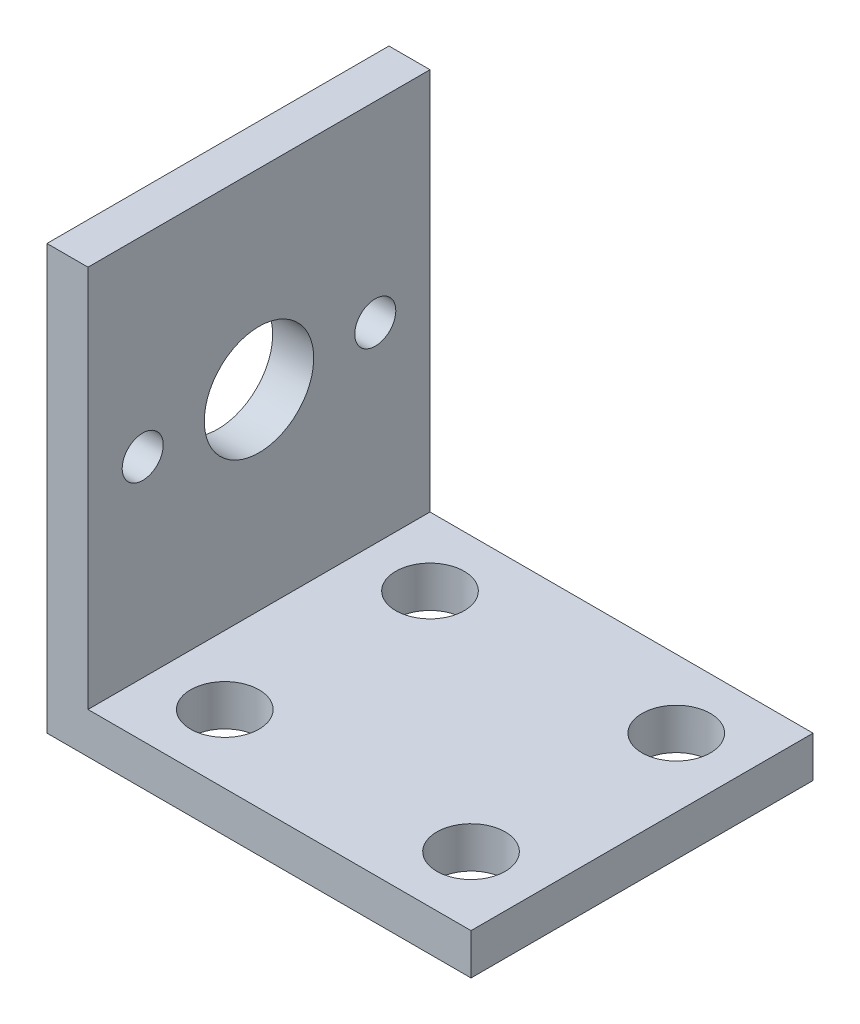
ISO-10303-21;
HEADER;
FILE_DESCRIPTION(('STEP AP214'),'2;1');
FILE_NAME('part.step','',(''),(''),'','','');
FILE_SCHEMA(('AUTOMOTIVE_DESIGN { 1 0 10303 214 1 1 1 1 }'));
ENDSEC;
DATA;
#1=APPLICATION_CONTEXT('core data for automotive mechanical design processes');
#2=APPLICATION_PROTOCOL_DEFINITION('international standard','automotive_design',2000,#1);
#3=PRODUCT_CONTEXT('',#1,'mechanical');
#4=PRODUCT('Part','Part','',(#3));
#5=PRODUCT_RELATED_PRODUCT_CATEGORY('part','',(#4));
#6=PRODUCT_DEFINITION_FORMATION('','',#4);
#7=PRODUCT_DEFINITION_CONTEXT('part definition',#1,'design');
#8=PRODUCT_DEFINITION('design','',#6,#7);
#9=PRODUCT_DEFINITION_SHAPE('','',#8);
#10=(LENGTH_UNIT() NAMED_UNIT(*) SI_UNIT(.MILLI.,.METRE.));
#11=(NAMED_UNIT(*) PLANE_ANGLE_UNIT() SI_UNIT($,.RADIAN.));
#12=(NAMED_UNIT(*) SI_UNIT($,.STERADIAN.) SOLID_ANGLE_UNIT());
#13=UNCERTAINTY_MEASURE_WITH_UNIT(LENGTH_MEASURE(1.E-05),#10,'distance_accuracy_value','');
#14=(GEOMETRIC_REPRESENTATION_CONTEXT(3) GLOBAL_UNCERTAINTY_ASSIGNED_CONTEXT((#13)) GLOBAL_UNIT_ASSIGNED_CONTEXT((#10,
#11,#12)) REPRESENTATION_CONTEXT('',''));
#15=CARTESIAN_POINT('',(0.,0.,0.));
#16=DIRECTION('',(0.,0.,1.));
#17=DIRECTION('',(1.,0.,0.));
#18=AXIS2_PLACEMENT_3D('',#15,#16,#17);
#19=CARTESIAN_POINT('',(3.00000000000001,0.,25.));
#20=DIRECTION('',(1.,0.,0.));
#21=DIRECTION('',(0.,1.,0.));
#22=AXIS2_PLACEMENT_3D('',#19,#20,#21);
#23=PLANE('',#22);
#24=CARTESIAN_POINT('',(3.00000000000001,17.,12.5));
#25=DIRECTION('',(1.,0.,0.));
#26=DIRECTION('',(0.,1.,0.));
#27=AXIS2_PLACEMENT_3D('',#24,#25,#26);
#28=CIRCLE('',#27,4.);
#29=CARTESIAN_POINT('',(3.00000000000001,21.,12.5));
#30=VERTEX_POINT('',#29);
#31=EDGE_CURVE('E163',#30,#30,#28,.T.);
#32=ORIENTED_EDGE('',*,*,#31,.F.);
#33=EDGE_LOOP('',(#32));
#34=FACE_BOUND('',#33,.T.);
#35=CARTESIAN_POINT('',(3.00000000000001,17.,4.));
#36=DIRECTION('',(1.,0.,0.));
#37=DIRECTION('',(0.,1.,0.));
#38=AXIS2_PLACEMENT_3D('',#35,#36,#37);
#39=CIRCLE('',#38,1.5);
#40=CARTESIAN_POINT('',(3.00000000000001,18.5,4.));
#41=VERTEX_POINT('',#40);
#42=EDGE_CURVE('E156',#41,#41,#39,.T.);
#43=ORIENTED_EDGE('',*,*,#42,.F.);
#44=EDGE_LOOP('',(#43));
#45=FACE_BOUND('',#44,.T.);
#46=CARTESIAN_POINT('',(3.00000000000001,17.,21.));
#47=DIRECTION('',(1.,0.,0.));
#48=DIRECTION('',(0.,1.,0.));
#49=AXIS2_PLACEMENT_3D('',#46,#47,#48);
#50=CIRCLE('',#49,1.5);
#51=CARTESIAN_POINT('',(3.00000000000001,18.5,21.));
#52=VERTEX_POINT('',#51);
#53=EDGE_CURVE('E150',#52,#52,#50,.T.);
#54=ORIENTED_EDGE('',*,*,#53,.F.);
#55=EDGE_LOOP('',(#54));
#56=FACE_BOUND('',#55,.T.);
#57=DIRECTION('',(0.,-1.,0.));
#58=VECTOR('',#57,1.);
#59=CARTESIAN_POINT('',(3.00000000000001,0.,0.));
#60=LINE('',#59,#58);
#61=CARTESIAN_POINT('',(3.,31.,0.));
#62=VERTEX_POINT('',#61);
#63=CARTESIAN_POINT('',(3.00000000000001,2.99999999999999,0.));
#64=VERTEX_POINT('',#63);
#65=EDGE_CURVE('E117',#62,#64,#60,.T.);
#66=ORIENTED_EDGE('',*,*,#65,.F.);
#67=DIRECTION('',(0.,0.,-1.));
#68=VECTOR('',#67,1.);
#69=CARTESIAN_POINT('',(3.,31.,25.));
#70=LINE('',#69,#68);
#71=CARTESIAN_POINT('',(3.,31.,25.));
#72=VERTEX_POINT('',#71);
#73=EDGE_CURVE('E11',#72,#62,#70,.T.);
#74=ORIENTED_EDGE('',*,*,#73,.F.);
#75=DIRECTION('',(0.,-1.,0.));
#76=VECTOR('',#75,1.);
#77=CARTESIAN_POINT('',(3.00000000000001,0.,25.));
#78=LINE('',#77,#76);
#79=CARTESIAN_POINT('',(3.00000000000001,2.99999999999999,25.));
#80=VERTEX_POINT('',#79);
#81=EDGE_CURVE('E131',#72,#80,#78,.T.);
#82=ORIENTED_EDGE('',*,*,#81,.T.);
#83=DIRECTION('',(0.,0.,-1.));
#84=VECTOR('',#83,1.);
#85=CARTESIAN_POINT('',(3.00000000000001,2.99999999999999,25.));
#86=LINE('',#85,#84);
#87=EDGE_CURVE('E82',#80,#64,#86,.T.);
#88=ORIENTED_EDGE('',*,*,#87,.T.);
#89=EDGE_LOOP('',(#66,#74,#82,#88));
#90=FACE_BOUND('',#89,.T.);
#91=ADVANCED_FACE('F37',(#34,#45,#56,#90),#23,.T.);
#92=CARTESIAN_POINT('',(0.,31.,25.));
#93=DIRECTION('',(0.,1.,0.));
#94=DIRECTION('',(0.,0.,1.));
#95=AXIS2_PLACEMENT_3D('',#92,#93,#94);
#96=PLANE('',#95);
#97=DIRECTION('',(1.,0.,0.));
#98=VECTOR('',#97,1.);
#99=CARTESIAN_POINT('',(0.,31.,0.));
#100=LINE('',#99,#98);
#101=CARTESIAN_POINT('',(0.,31.,0.));
#102=VERTEX_POINT('',#101);
#103=EDGE_CURVE('E120',#102,#62,#100,.T.);
#104=ORIENTED_EDGE('',*,*,#103,.F.);
#105=DIRECTION('',(0.,0.,-1.));
#106=VECTOR('',#105,1.);
#107=CARTESIAN_POINT('',(0.,31.,25.));
#108=LINE('',#107,#106);
#109=CARTESIAN_POINT('',(0.,31.,25.));
#110=VERTEX_POINT('',#109);
#111=EDGE_CURVE('E45',#110,#102,#108,.T.);
#112=ORIENTED_EDGE('',*,*,#111,.F.);
#113=DIRECTION('',(1.,0.,0.));
#114=VECTOR('',#113,1.);
#115=CARTESIAN_POINT('',(0.,31.,25.));
#116=LINE('',#115,#114);
#117=EDGE_CURVE('E146',#110,#72,#116,.T.);
#118=ORIENTED_EDGE('',*,*,#117,.T.);
#119=ORIENTED_EDGE('',*,*,#73,.T.);
#120=EDGE_LOOP('',(#104,#112,#118,#119));
#121=FACE_BOUND('',#120,.T.);
#122=ADVANCED_FACE('F140',(#121),#96,.T.);
#123=CARTESIAN_POINT('',(0.,0.,25.));
#124=DIRECTION('',(-1.,0.,0.));
#125=DIRECTION('',(0.,0.,1.));
#126=AXIS2_PLACEMENT_3D('',#123,#124,#125);
#127=PLANE('',#126);
#128=CARTESIAN_POINT('',(0.,17.,12.5));
#129=DIRECTION('',(1.,0.,0.));
#130=DIRECTION('',(0.,1.,0.));
#131=AXIS2_PLACEMENT_3D('',#128,#129,#130);
#132=CIRCLE('',#131,4.);
#133=CARTESIAN_POINT('',(0.,21.,12.5));
#134=VERTEX_POINT('',#133);
#135=EDGE_CURVE('E153',#134,#134,#132,.T.);
#136=ORIENTED_EDGE('',*,*,#135,.T.);
#137=EDGE_LOOP('',(#136));
#138=FACE_BOUND('',#137,.T.);
#139=CARTESIAN_POINT('',(0.,17.,4.));
#140=DIRECTION('',(1.,0.,0.));
#141=DIRECTION('',(0.,1.,0.));
#142=AXIS2_PLACEMENT_3D('',#139,#140,#141);
#143=CIRCLE('',#142,1.5);
#144=CARTESIAN_POINT('',(0.,18.5,4.));
#145=VERTEX_POINT('',#144);
#146=EDGE_CURVE('E159',#145,#145,#143,.T.);
#147=ORIENTED_EDGE('',*,*,#146,.T.);
#148=EDGE_LOOP('',(#147));
#149=FACE_BOUND('',#148,.T.);
#150=CARTESIAN_POINT('',(0.,17.,21.));
#151=DIRECTION('',(1.,0.,0.));
#152=DIRECTION('',(0.,1.,0.));
#153=AXIS2_PLACEMENT_3D('',#150,#151,#152);
#154=CIRCLE('',#153,1.5);
#155=CARTESIAN_POINT('',(0.,18.5,21.));
#156=VERTEX_POINT('',#155);
#157=EDGE_CURVE('E121',#156,#156,#154,.T.);
#158=ORIENTED_EDGE('',*,*,#157,.T.);
#159=EDGE_LOOP('',(#158));
#160=FACE_BOUND('',#159,.T.);
#161=DIRECTION('',(0.,1.,0.));
#162=VECTOR('',#161,1.);
#163=CARTESIAN_POINT('',(0.,0.,0.));
#164=LINE('',#163,#162);
#165=CARTESIAN_POINT('',(0.,0.,0.));
#166=VERTEX_POINT('',#165);
#167=EDGE_CURVE('E124',#166,#102,#164,.T.);
#168=ORIENTED_EDGE('',*,*,#167,.F.);
#169=DIRECTION('',(0.,0.,-1.));
#170=VECTOR('',#169,1.);
#171=CARTESIAN_POINT('',(0.,0.,25.));
#172=LINE('',#171,#170);
#173=CARTESIAN_POINT('',(0.,0.,25.));
#174=VERTEX_POINT('',#173);
#175=EDGE_CURVE('E109',#174,#166,#172,.T.);
#176=ORIENTED_EDGE('',*,*,#175,.F.);
#177=DIRECTION('',(0.,1.,0.));
#178=VECTOR('',#177,1.);
#179=CARTESIAN_POINT('',(0.,0.,25.));
#180=LINE('',#179,#178);
#181=EDGE_CURVE('E102',#174,#110,#180,.T.);
#182=ORIENTED_EDGE('',*,*,#181,.T.);
#183=ORIENTED_EDGE('',*,*,#111,.T.);
#184=EDGE_LOOP('',(#168,#176,#182,#183));
#185=FACE_BOUND('',#184,.T.);
#186=ADVANCED_FACE('F137',(#138,#149,#160,#185),#127,.T.);
#187=CARTESIAN_POINT('',(0.,0.,25.));
#188=DIRECTION('',(0.,1.,0.));
#189=DIRECTION('',(0.,0.,1.));
#190=AXIS2_PLACEMENT_3D('',#187,#188,#189);
#191=PLANE('',#190);
#192=CARTESIAN_POINT('',(26.,0.,5.));
#193=DIRECTION('',(0.,1.,0.));
#194=DIRECTION('',(0.,0.,1.));
#195=AXIS2_PLACEMENT_3D('',#192,#193,#194);
#196=CIRCLE('',#195,2.5);
#197=CARTESIAN_POINT('',(26.,0.,7.5));
#198=VERTEX_POINT('',#197);
#199=EDGE_CURVE('E173',#198,#198,#196,.F.);
#200=ORIENTED_EDGE('',*,*,#199,.F.);
#201=EDGE_LOOP('',(#200));
#202=FACE_BOUND('',#201,.T.);
#203=CARTESIAN_POINT('',(26.,0.,20.));
#204=DIRECTION('',(0.,1.,0.));
#205=DIRECTION('',(0.,0.,1.));
#206=AXIS2_PLACEMENT_3D('',#203,#204,#205);
#207=CIRCLE('',#206,2.5);
#208=CARTESIAN_POINT('',(26.,0.,22.5));
#209=VERTEX_POINT('',#208);
#210=EDGE_CURVE('E181',#209,#209,#207,.F.);
#211=ORIENTED_EDGE('',*,*,#210,.F.);
#212=EDGE_LOOP('',(#211));
#213=FACE_BOUND('',#212,.T.);
#214=CARTESIAN_POINT('',(8.00000000000001,0.,20.));
#215=DIRECTION('',(0.,1.,0.));
#216=DIRECTION('',(0.,0.,1.));
#217=AXIS2_PLACEMENT_3D('',#214,#215,#216);
#218=CIRCLE('',#217,2.5);
#219=CARTESIAN_POINT('',(8.00000000000001,0.,22.5));
#220=VERTEX_POINT('',#219);
#221=EDGE_CURVE('E174',#220,#220,#218,.F.);
#222=ORIENTED_EDGE('',*,*,#221,.F.);
#223=EDGE_LOOP('',(#222));
#224=FACE_BOUND('',#223,.T.);
#225=CARTESIAN_POINT('',(8.00000000000001,0.,5.));
#226=DIRECTION('',(0.,1.,0.));
#227=DIRECTION('',(0.,0.,1.));
#228=AXIS2_PLACEMENT_3D('',#225,#226,#227);
#229=CIRCLE('',#228,2.5);
#230=CARTESIAN_POINT('',(8.00000000000001,0.,7.5));
#231=VERTEX_POINT('',#230);
#232=EDGE_CURVE('E160',#231,#231,#229,.F.);
#233=ORIENTED_EDGE('',*,*,#232,.F.);
#234=EDGE_LOOP('',(#233));
#235=FACE_BOUND('',#234,.T.);
#236=DIRECTION('',(1.,0.,0.));
#237=VECTOR('',#236,1.);
#238=CARTESIAN_POINT('',(0.,0.,0.));
#239=LINE('',#238,#237);
#240=CARTESIAN_POINT('',(31.,0.,0.));
#241=VERTEX_POINT('',#240);
#242=EDGE_CURVE('E108',#166,#241,#239,.T.);
#243=ORIENTED_EDGE('',*,*,#242,.T.);
#244=DIRECTION('',(0.,0.,-1.));
#245=VECTOR('',#244,1.);
#246=CARTESIAN_POINT('',(31.,0.,25.));
#247=LINE('',#246,#245);
#248=CARTESIAN_POINT('',(31.,0.,25.));
#249=VERTEX_POINT('',#248);
#250=EDGE_CURVE('E105',#249,#241,#247,.T.);
#251=ORIENTED_EDGE('',*,*,#250,.F.);
#252=DIRECTION('',(1.,0.,0.));
#253=VECTOR('',#252,1.);
#254=CARTESIAN_POINT('',(0.,0.,25.));
#255=LINE('',#254,#253);
#256=EDGE_CURVE('E95',#174,#249,#255,.T.);
#257=ORIENTED_EDGE('',*,*,#256,.F.);
#258=ORIENTED_EDGE('',*,*,#175,.T.);
#259=EDGE_LOOP('',(#243,#251,#257,#258));
#260=FACE_BOUND('',#259,.T.);
#261=ADVANCED_FACE('F106',(#202,#213,#224,#235,#260),#191,.F.);
#262=CARTESIAN_POINT('',(31.,0.,25.));
#263=DIRECTION('',(-1.,0.,0.));
#264=DIRECTION('',(0.,0.,1.));
#265=AXIS2_PLACEMENT_3D('',#262,#263,#264);
#266=PLANE('',#265);
#267=DIRECTION('',(0.,1.,0.));
#268=VECTOR('',#267,1.);
#269=CARTESIAN_POINT('',(31.,0.,0.));
#270=LINE('',#269,#268);
#271=CARTESIAN_POINT('',(31.,3.,0.));
#272=VERTEX_POINT('',#271);
#273=EDGE_CURVE('E75',#241,#272,#270,.T.);
#274=ORIENTED_EDGE('',*,*,#273,.T.);
#275=DIRECTION('',(0.,0.,-1.));
#276=VECTOR('',#275,1.);
#277=CARTESIAN_POINT('',(31.,3.,25.));
#278=LINE('',#277,#276);
#279=CARTESIAN_POINT('',(31.,3.,25.));
#280=VERTEX_POINT('',#279);
#281=EDGE_CURVE('E110',#280,#272,#278,.T.);
#282=ORIENTED_EDGE('',*,*,#281,.F.);
#283=DIRECTION('',(0.,1.,0.));
#284=VECTOR('',#283,1.);
#285=CARTESIAN_POINT('',(31.,0.,25.));
#286=LINE('',#285,#284);
#287=EDGE_CURVE('E99',#249,#280,#286,.T.);
#288=ORIENTED_EDGE('',*,*,#287,.F.);
#289=ORIENTED_EDGE('',*,*,#250,.T.);
#290=EDGE_LOOP('',(#274,#282,#288,#289));
#291=FACE_BOUND('',#290,.T.);
#292=ADVANCED_FACE('F112',(#291),#266,.F.);
#293=CARTESIAN_POINT('',(0.,2.99999999999999,25.));
#294=DIRECTION('',(0.,-1.,0.));
#295=DIRECTION('',(1.,0.,0.));
#296=AXIS2_PLACEMENT_3D('',#293,#294,#295);
#297=PLANE('',#296);
#298=CARTESIAN_POINT('',(26.,3.,5.));
#299=DIRECTION('',(0.,1.,0.));
#300=DIRECTION('',(-1.,0.,0.));
#301=AXIS2_PLACEMENT_3D('',#298,#299,#300);
#302=CIRCLE('',#301,2.5);
#303=CARTESIAN_POINT('',(23.5,3.,5.));
#304=VERTEX_POINT('',#303);
#305=EDGE_CURVE('E184',#304,#304,#302,.T.);
#306=ORIENTED_EDGE('',*,*,#305,.F.);
#307=EDGE_LOOP('',(#306));
#308=FACE_BOUND('',#307,.T.);
#309=CARTESIAN_POINT('',(26.,3.,20.));
#310=DIRECTION('',(0.,1.,0.));
#311=DIRECTION('',(-1.,0.,0.));
#312=AXIS2_PLACEMENT_3D('',#309,#310,#311);
#313=CIRCLE('',#312,2.5);
#314=CARTESIAN_POINT('',(23.5,3.,20.));
#315=VERTEX_POINT('',#314);
#316=EDGE_CURVE('E177',#315,#315,#313,.T.);
#317=ORIENTED_EDGE('',*,*,#316,.F.);
#318=EDGE_LOOP('',(#317));
#319=FACE_BOUND('',#318,.T.);
#320=CARTESIAN_POINT('',(8.00000000000001,3.,20.));
#321=DIRECTION('',(0.,1.,0.));
#322=DIRECTION('',(-1.,0.,0.));
#323=AXIS2_PLACEMENT_3D('',#320,#321,#322);
#324=CIRCLE('',#323,2.5);
#325=CARTESIAN_POINT('',(5.50000000000001,2.99999999999999,20.));
#326=VERTEX_POINT('',#325);
#327=EDGE_CURVE('E178',#326,#326,#324,.T.);
#328=ORIENTED_EDGE('',*,*,#327,.F.);
#329=EDGE_LOOP('',(#328));
#330=FACE_BOUND('',#329,.T.);
#331=CARTESIAN_POINT('',(8.00000000000001,3.,5.));
#332=DIRECTION('',(0.,1.,0.));
#333=DIRECTION('',(-1.,0.,0.));
#334=AXIS2_PLACEMENT_3D('',#331,#332,#333);
#335=CIRCLE('',#334,2.5);
#336=CARTESIAN_POINT('',(5.50000000000001,2.99999999999999,5.));
#337=VERTEX_POINT('',#336);
#338=EDGE_CURVE('E170',#337,#337,#335,.T.);
#339=ORIENTED_EDGE('',*,*,#338,.F.);
#340=EDGE_LOOP('',(#339));
#341=FACE_BOUND('',#340,.T.);
#342=DIRECTION('',(-1.,0.,0.));
#343=VECTOR('',#342,1.);
#344=CARTESIAN_POINT('',(0.,2.99999999999999,0.));
#345=LINE('',#344,#343);
#346=EDGE_CURVE('E129',#272,#64,#345,.T.);
#347=ORIENTED_EDGE('',*,*,#346,.T.);
#348=ORIENTED_EDGE('',*,*,#87,.F.);
#349=DIRECTION('',(-1.,0.,0.));
#350=VECTOR('',#349,1.);
#351=CARTESIAN_POINT('',(0.,2.99999999999999,25.));
#352=LINE('',#351,#350);
#353=EDGE_CURVE('E53',#280,#80,#352,.T.);
#354=ORIENTED_EDGE('',*,*,#353,.F.);
#355=ORIENTED_EDGE('',*,*,#281,.T.);
#356=EDGE_LOOP('',(#347,#348,#354,#355));
#357=FACE_BOUND('',#356,.T.);
#358=ADVANCED_FACE('F145',(#308,#319,#330,#341,#357),#297,.F.);
#359=CARTESIAN_POINT('',(0.,0.,25.));
#360=DIRECTION('',(0.,0.,1.));
#361=DIRECTION('',(1.,0.,0.));
#362=AXIS2_PLACEMENT_3D('',#359,#360,#361);
#363=PLANE('',#362);
#364=ORIENTED_EDGE('',*,*,#81,.F.);
#365=ORIENTED_EDGE('',*,*,#117,.F.);
#366=ORIENTED_EDGE('',*,*,#181,.F.);
#367=ORIENTED_EDGE('',*,*,#256,.T.);
#368=ORIENTED_EDGE('',*,*,#287,.T.);
#369=ORIENTED_EDGE('',*,*,#353,.T.);
#370=EDGE_LOOP('',(#364,#365,#366,#367,#368,#369));
#371=FACE_BOUND('',#370,.T.);
#372=ADVANCED_FACE('F97',(#371),#363,.T.);
#373=CARTESIAN_POINT('',(0.,0.,0.));
#374=DIRECTION('',(0.,0.,1.));
#375=DIRECTION('',(1.,0.,0.));
#376=AXIS2_PLACEMENT_3D('',#373,#374,#375);
#377=PLANE('',#376);
#378=ORIENTED_EDGE('',*,*,#65,.T.);
#379=ORIENTED_EDGE('',*,*,#346,.F.);
#380=ORIENTED_EDGE('',*,*,#273,.F.);
#381=ORIENTED_EDGE('',*,*,#242,.F.);
#382=ORIENTED_EDGE('',*,*,#167,.T.);
#383=ORIENTED_EDGE('',*,*,#103,.T.);
#384=EDGE_LOOP('',(#378,#379,#380,#381,#382,#383));
#385=FACE_BOUND('',#384,.T.);
#386=ADVANCED_FACE('F142',(#385),#377,.F.);
#387=CARTESIAN_POINT('',(0.,17.,21.));
#388=DIRECTION('',(1.,0.,0.));
#389=DIRECTION('',(0.,1.,0.));
#390=AXIS2_PLACEMENT_3D('',#387,#388,#389);
#391=CYLINDRICAL_SURFACE('',#390,1.5);
#392=ORIENTED_EDGE('',*,*,#157,.F.);
#393=EDGE_LOOP('',(#392));
#394=FACE_BOUND('',#393,.T.);
#395=ORIENTED_EDGE('',*,*,#53,.T.);
#396=EDGE_LOOP('',(#395));
#397=FACE_BOUND('',#396,.T.);
#398=ADVANCED_FACE('F235',(#394,#397),#391,.F.);
#399=CARTESIAN_POINT('',(0.,17.,4.));
#400=DIRECTION('',(1.,0.,0.));
#401=DIRECTION('',(0.,1.,0.));
#402=AXIS2_PLACEMENT_3D('',#399,#400,#401);
#403=CYLINDRICAL_SURFACE('',#402,1.5);
#404=ORIENTED_EDGE('',*,*,#146,.F.);
#405=EDGE_LOOP('',(#404));
#406=FACE_BOUND('',#405,.T.);
#407=ORIENTED_EDGE('',*,*,#42,.T.);
#408=EDGE_LOOP('',(#407));
#409=FACE_BOUND('',#408,.T.);
#410=ADVANCED_FACE('F237',(#406,#409),#403,.F.);
#411=CARTESIAN_POINT('',(0.,17.,12.5));
#412=DIRECTION('',(1.,0.,0.));
#413=DIRECTION('',(0.,1.,0.));
#414=AXIS2_PLACEMENT_3D('',#411,#412,#413);
#415=CYLINDRICAL_SURFACE('',#414,4.);
#416=ORIENTED_EDGE('',*,*,#135,.F.);
#417=EDGE_LOOP('',(#416));
#418=FACE_BOUND('',#417,.T.);
#419=ORIENTED_EDGE('',*,*,#31,.T.);
#420=EDGE_LOOP('',(#419));
#421=FACE_BOUND('',#420,.T.);
#422=ADVANCED_FACE('F208',(#418,#421),#415,.F.);
#423=CARTESIAN_POINT('',(8.00000000000001,-0.00100000000000404,5.));
#424=DIRECTION('',(0.,1.,0.));
#425=DIRECTION('',(-1.,0.,0.));
#426=AXIS2_PLACEMENT_3D('',#423,#424,#425);
#427=CYLINDRICAL_SURFACE('',#426,2.5);
#428=ORIENTED_EDGE('',*,*,#338,.T.);
#429=EDGE_LOOP('',(#428));
#430=FACE_BOUND('',#429,.T.);
#431=ORIENTED_EDGE('',*,*,#232,.T.);
#432=EDGE_LOOP('',(#431));
#433=FACE_BOUND('',#432,.T.);
#434=ADVANCED_FACE('F204',(#430,#433),#427,.F.);
#435=CARTESIAN_POINT('',(8.00000000000001,-0.00100000000000404,20.));
#436=DIRECTION('',(0.,1.,0.));
#437=DIRECTION('',(-1.,0.,0.));
#438=AXIS2_PLACEMENT_3D('',#435,#436,#437);
#439=CYLINDRICAL_SURFACE('',#438,2.5);
#440=ORIENTED_EDGE('',*,*,#327,.T.);
#441=EDGE_LOOP('',(#440));
#442=FACE_BOUND('',#441,.T.);
#443=ORIENTED_EDGE('',*,*,#221,.T.);
#444=EDGE_LOOP('',(#443));
#445=FACE_BOUND('',#444,.T.);
#446=ADVANCED_FACE('F207',(#442,#445),#439,.F.);
#447=CARTESIAN_POINT('',(26.,-0.00100000000000057,20.));
#448=DIRECTION('',(0.,1.,0.));
#449=DIRECTION('',(-1.,0.,0.));
#450=AXIS2_PLACEMENT_3D('',#447,#448,#449);
#451=CYLINDRICAL_SURFACE('',#450,2.5);
#452=ORIENTED_EDGE('',*,*,#316,.T.);
#453=EDGE_LOOP('',(#452));
#454=FACE_BOUND('',#453,.T.);
#455=ORIENTED_EDGE('',*,*,#210,.T.);
#456=EDGE_LOOP('',(#455));
#457=FACE_BOUND('',#456,.T.);
#458=ADVANCED_FACE('F297',(#454,#457),#451,.F.);
#459=CARTESIAN_POINT('',(26.,-0.00100000000000057,5.));
#460=DIRECTION('',(0.,1.,0.));
#461=DIRECTION('',(-1.,0.,0.));
#462=AXIS2_PLACEMENT_3D('',#459,#460,#461);
#463=CYLINDRICAL_SURFACE('',#462,2.5);
#464=ORIENTED_EDGE('',*,*,#305,.T.);
#465=EDGE_LOOP('',(#464));
#466=FACE_BOUND('',#465,.T.);
#467=ORIENTED_EDGE('',*,*,#199,.T.);
#468=EDGE_LOOP('',(#467));
#469=FACE_BOUND('',#468,.T.);
#470=ADVANCED_FACE('F192',(#466,#469),#463,.F.);
#471=CLOSED_SHELL('',(#91,#122,#186,#261,#292,#358,#372,#386,#398,#410,#422,#434,#446,#458,#470));
#472=MANIFOLD_SOLID_BREP('B2',#471);
#473=ADVANCED_BREP_SHAPE_REPRESENTATION('',(#18,#472),#14);
#474=SHAPE_DEFINITION_REPRESENTATION(#9,#473);
ENDSEC;
END-ISO-10303-21;
